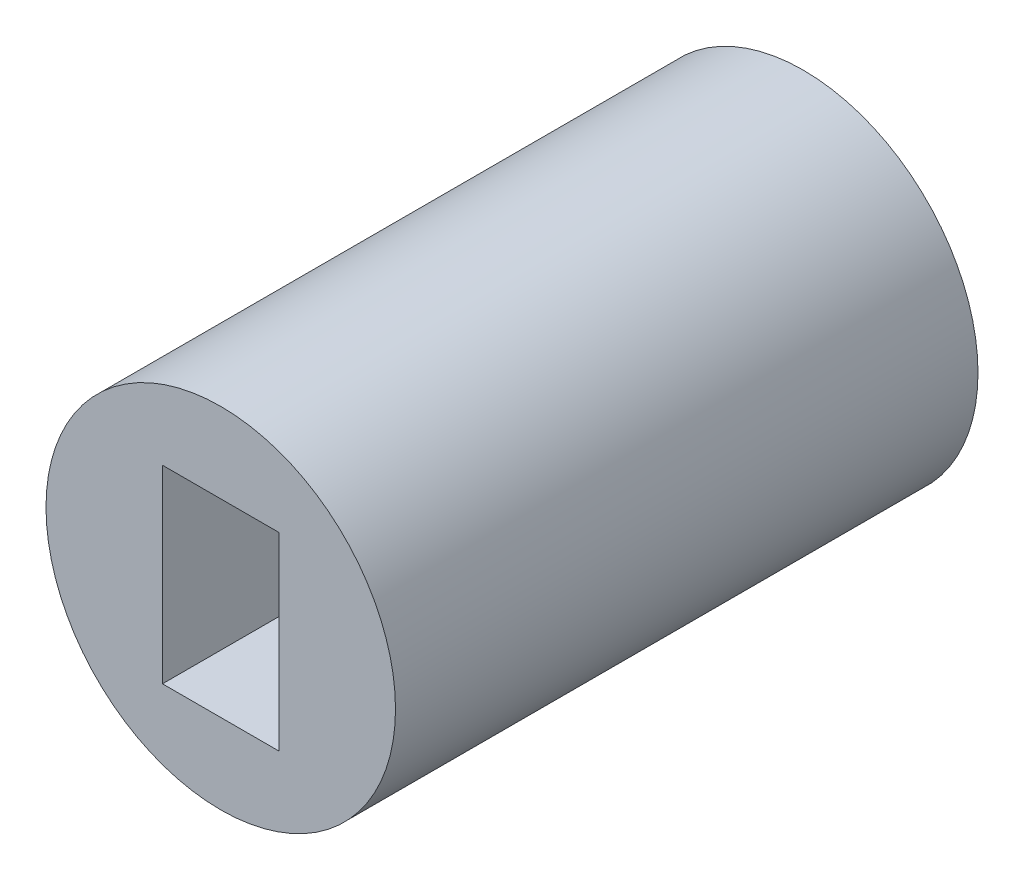
ISO-10303-21;
HEADER;
FILE_DESCRIPTION(('STEP AP214'),'2;1');
FILE_NAME('part.step','',(''),(''),'','','');
FILE_SCHEMA(('AUTOMOTIVE_DESIGN { 1 0 10303 214 1 1 1 1 }'));
ENDSEC;
DATA;
#1=APPLICATION_CONTEXT('core data for automotive mechanical design processes');
#2=APPLICATION_PROTOCOL_DEFINITION('international standard','automotive_design',2000,#1);
#3=PRODUCT_CONTEXT('',#1,'mechanical');
#4=PRODUCT('Part','Part','',(#3));
#5=PRODUCT_RELATED_PRODUCT_CATEGORY('part','',(#4));
#6=PRODUCT_DEFINITION_FORMATION('','',#4);
#7=PRODUCT_DEFINITION_CONTEXT('part definition',#1,'design');
#8=PRODUCT_DEFINITION('design','',#6,#7);
#9=PRODUCT_DEFINITION_SHAPE('','',#8);
#10=(LENGTH_UNIT() NAMED_UNIT(*) SI_UNIT(.MILLI.,.METRE.));
#11=(NAMED_UNIT(*) PLANE_ANGLE_UNIT() SI_UNIT($,.RADIAN.));
#12=(NAMED_UNIT(*) SI_UNIT($,.STERADIAN.) SOLID_ANGLE_UNIT());
#13=UNCERTAINTY_MEASURE_WITH_UNIT(LENGTH_MEASURE(1.E-05),#10,'distance_accuracy_value','');
#14=(GEOMETRIC_REPRESENTATION_CONTEXT(3) GLOBAL_UNCERTAINTY_ASSIGNED_CONTEXT((#13)) GLOBAL_UNIT_ASSIGNED_CONTEXT((#10,
#11,#12)) REPRESENTATION_CONTEXT('',''));
#15=CARTESIAN_POINT('',(0.,0.,0.));
#16=DIRECTION('',(0.,0.,1.));
#17=DIRECTION('',(1.,0.,0.));
#18=AXIS2_PLACEMENT_3D('',#15,#16,#17);
#19=CARTESIAN_POINT('',(0.,0.,20.));
#20=DIRECTION('',(0.,0.,-1.));
#21=DIRECTION('',(-1.,0.,0.));
#22=AXIS2_PLACEMENT_3D('',#19,#20,#21);
#23=CYLINDRICAL_SURFACE('',#22,6.);
#24=CARTESIAN_POINT('',(0.,0.,20.));
#25=DIRECTION('',(0.,0.,1.));
#26=DIRECTION('',(1.,0.,0.));
#27=AXIS2_PLACEMENT_3D('',#24,#25,#26);
#28=CIRCLE('',#27,6.);
#29=CARTESIAN_POINT('',(6.,0.,20.));
#30=VERTEX_POINT('',#29);
#31=EDGE_CURVE('E11',#30,#30,#28,.T.);
#32=ORIENTED_EDGE('',*,*,#31,.F.);
#33=EDGE_LOOP('',(#32));
#34=FACE_BOUND('',#33,.T.);
#35=CARTESIAN_POINT('',(0.,0.,0.));
#36=DIRECTION('',(0.,0.,1.));
#37=DIRECTION('',(1.,0.,0.));
#38=AXIS2_PLACEMENT_3D('',#35,#36,#37);
#39=CIRCLE('',#38,6.);
#40=CARTESIAN_POINT('',(6.,0.,0.));
#41=VERTEX_POINT('',#40);
#42=EDGE_CURVE('E33',#41,#41,#39,.T.);
#43=ORIENTED_EDGE('',*,*,#42,.T.);
#44=EDGE_LOOP('',(#43));
#45=FACE_BOUND('',#44,.T.);
#46=ADVANCED_FACE('F30',(#34,#45),#23,.T.);
#47=CARTESIAN_POINT('',(0.,0.,20.));
#48=DIRECTION('',(0.,0.,1.));
#49=DIRECTION('',(1.,0.,0.));
#50=AXIS2_PLACEMENT_3D('',#47,#48,#49);
#51=PLANE('',#50);
#52=DIRECTION('',(0.,1.,0.));
#53=VECTOR('',#52,1.);
#54=CARTESIAN_POINT('',(-2.,3.25,20.));
#55=LINE('',#54,#53);
#56=CARTESIAN_POINT('',(-2.,-3.25,20.));
#57=VERTEX_POINT('',#56);
#58=CARTESIAN_POINT('',(-2.,3.25,20.));
#59=VERTEX_POINT('',#58);
#60=EDGE_CURVE('E72',#57,#59,#55,.T.);
#61=ORIENTED_EDGE('',*,*,#60,.T.);
#62=DIRECTION('',(1.,0.,0.));
#63=VECTOR('',#62,1.);
#64=CARTESIAN_POINT('',(2.,3.25,20.));
#65=LINE('',#64,#63);
#66=CARTESIAN_POINT('',(2.,3.25,20.));
#67=VERTEX_POINT('',#66);
#68=EDGE_CURVE('E81',#59,#67,#65,.T.);
#69=ORIENTED_EDGE('',*,*,#68,.T.);
#70=DIRECTION('',(0.,-1.,0.));
#71=VECTOR('',#70,1.);
#72=CARTESIAN_POINT('',(2.,3.25,20.));
#73=LINE('',#72,#71);
#74=CARTESIAN_POINT('',(2.,-3.25,20.));
#75=VERTEX_POINT('',#74);
#76=EDGE_CURVE('E44',#67,#75,#73,.T.);
#77=ORIENTED_EDGE('',*,*,#76,.T.);
#78=DIRECTION('',(-1.,0.,0.));
#79=VECTOR('',#78,1.);
#80=CARTESIAN_POINT('',(2.,-3.25,20.));
#81=LINE('',#80,#79);
#82=EDGE_CURVE('E78',#75,#57,#81,.T.);
#83=ORIENTED_EDGE('',*,*,#82,.T.);
#84=EDGE_LOOP('',(#61,#69,#77,#83));
#85=FACE_BOUND('',#84,.T.);
#86=ORIENTED_EDGE('',*,*,#31,.T.);
#87=EDGE_LOOP('',(#86));
#88=FACE_BOUND('',#87,.T.);
#89=ADVANCED_FACE('F85',(#85,#88),#51,.T.);
#90=CARTESIAN_POINT('',(0.,0.,0.));
#91=DIRECTION('',(0.,0.,1.));
#92=DIRECTION('',(1.,0.,0.));
#93=AXIS2_PLACEMENT_3D('',#90,#91,#92);
#94=PLANE('',#93);
#95=DIRECTION('',(1.,0.,0.));
#96=VECTOR('',#95,1.);
#97=CARTESIAN_POINT('',(2.,3.25,0.));
#98=LINE('',#97,#96);
#99=CARTESIAN_POINT('',(-2.,3.25,0.));
#100=VERTEX_POINT('',#99);
#101=CARTESIAN_POINT('',(2.,3.25,0.));
#102=VERTEX_POINT('',#101);
#103=EDGE_CURVE('E97',#100,#102,#98,.T.);
#104=ORIENTED_EDGE('',*,*,#103,.F.);
#105=DIRECTION('',(0.,1.,0.));
#106=VECTOR('',#105,1.);
#107=CARTESIAN_POINT('',(-2.,3.25,0.));
#108=LINE('',#107,#106);
#109=CARTESIAN_POINT('',(-2.,-3.25,0.));
#110=VERTEX_POINT('',#109);
#111=EDGE_CURVE('E52',#110,#100,#108,.T.);
#112=ORIENTED_EDGE('',*,*,#111,.F.);
#113=DIRECTION('',(-1.,0.,0.));
#114=VECTOR('',#113,1.);
#115=CARTESIAN_POINT('',(2.,-3.25,0.));
#116=LINE('',#115,#114);
#117=CARTESIAN_POINT('',(2.,-3.25,0.));
#118=VERTEX_POINT('',#117);
#119=EDGE_CURVE('E88',#118,#110,#116,.T.);
#120=ORIENTED_EDGE('',*,*,#119,.F.);
#121=DIRECTION('',(0.,-1.,0.));
#122=VECTOR('',#121,1.);
#123=CARTESIAN_POINT('',(2.,3.25,0.));
#124=LINE('',#123,#122);
#125=EDGE_CURVE('E91',#102,#118,#124,.T.);
#126=ORIENTED_EDGE('',*,*,#125,.F.);
#127=EDGE_LOOP('',(#104,#112,#120,#126));
#128=FACE_BOUND('',#127,.T.);
#129=ORIENTED_EDGE('',*,*,#42,.F.);
#130=EDGE_LOOP('',(#129));
#131=FACE_BOUND('',#130,.T.);
#132=ADVANCED_FACE('F109',(#128,#131),#94,.F.);
#133=CARTESIAN_POINT('',(-2.,3.25,20.));
#134=DIRECTION('',(-1.,0.,0.));
#135=DIRECTION('',(0.,-1.,0.));
#136=AXIS2_PLACEMENT_3D('',#133,#134,#135);
#137=PLANE('',#136);
#138=ORIENTED_EDGE('',*,*,#111,.T.);
#139=DIRECTION('',(0.,0.,-1.));
#140=VECTOR('',#139,1.);
#141=CARTESIAN_POINT('',(-2.,3.25,20.));
#142=LINE('',#141,#140);
#143=EDGE_CURVE('E68',#59,#100,#142,.T.);
#144=ORIENTED_EDGE('',*,*,#143,.F.);
#145=ORIENTED_EDGE('',*,*,#60,.F.);
#146=DIRECTION('',(0.,0.,-1.));
#147=VECTOR('',#146,1.);
#148=CARTESIAN_POINT('',(-2.,-3.25,20.));
#149=LINE('',#148,#147);
#150=EDGE_CURVE('E101',#57,#110,#149,.T.);
#151=ORIENTED_EDGE('',*,*,#150,.T.);
#152=EDGE_LOOP('',(#138,#144,#145,#151));
#153=FACE_BOUND('',#152,.T.);
#154=ADVANCED_FACE('F70',(#153),#137,.F.);
#155=CARTESIAN_POINT('',(2.,-3.25,20.));
#156=DIRECTION('',(0.,-1.,0.));
#157=DIRECTION('',(0.,0.,-1.));
#158=AXIS2_PLACEMENT_3D('',#155,#156,#157);
#159=PLANE('',#158);
#160=ORIENTED_EDGE('',*,*,#119,.T.);
#161=ORIENTED_EDGE('',*,*,#150,.F.);
#162=ORIENTED_EDGE('',*,*,#82,.F.);
#163=DIRECTION('',(0.,0.,-1.));
#164=VECTOR('',#163,1.);
#165=CARTESIAN_POINT('',(2.,-3.25,20.));
#166=LINE('',#165,#164);
#167=EDGE_CURVE('E103',#75,#118,#166,.T.);
#168=ORIENTED_EDGE('',*,*,#167,.T.);
#169=EDGE_LOOP('',(#160,#161,#162,#168));
#170=FACE_BOUND('',#169,.T.);
#171=ADVANCED_FACE('F112',(#170),#159,.F.);
#172=CARTESIAN_POINT('',(2.,3.25,20.));
#173=DIRECTION('',(1.,0.,0.));
#174=DIRECTION('',(0.,1.,0.));
#175=AXIS2_PLACEMENT_3D('',#172,#173,#174);
#176=PLANE('',#175);
#177=ORIENTED_EDGE('',*,*,#125,.T.);
#178=ORIENTED_EDGE('',*,*,#167,.F.);
#179=ORIENTED_EDGE('',*,*,#76,.F.);
#180=DIRECTION('',(0.,0.,-1.));
#181=VECTOR('',#180,1.);
#182=CARTESIAN_POINT('',(2.,3.25,20.));
#183=LINE('',#182,#181);
#184=EDGE_CURVE('E77',#67,#102,#183,.T.);
#185=ORIENTED_EDGE('',*,*,#184,.T.);
#186=EDGE_LOOP('',(#177,#178,#179,#185));
#187=FACE_BOUND('',#186,.T.);
#188=ADVANCED_FACE('F105',(#187),#176,.F.);
#189=CARTESIAN_POINT('',(2.,3.25,20.));
#190=DIRECTION('',(0.,1.,0.));
#191=DIRECTION('',(0.,0.,1.));
#192=AXIS2_PLACEMENT_3D('',#189,#190,#191);
#193=PLANE('',#192);
#194=ORIENTED_EDGE('',*,*,#103,.T.);
#195=ORIENTED_EDGE('',*,*,#184,.F.);
#196=ORIENTED_EDGE('',*,*,#68,.F.);
#197=ORIENTED_EDGE('',*,*,#143,.T.);
#198=EDGE_LOOP('',(#194,#195,#196,#197));
#199=FACE_BOUND('',#198,.T.);
#200=ADVANCED_FACE('F82',(#199),#193,.F.);
#201=CLOSED_SHELL('',(#46,#89,#132,#154,#171,#188,#200));
#202=MANIFOLD_SOLID_BREP('B2',#201);
#203=ADVANCED_BREP_SHAPE_REPRESENTATION('',(#18,#202),#14);
#204=SHAPE_DEFINITION_REPRESENTATION(#9,#203);
ENDSEC;
END-ISO-10303-21;
